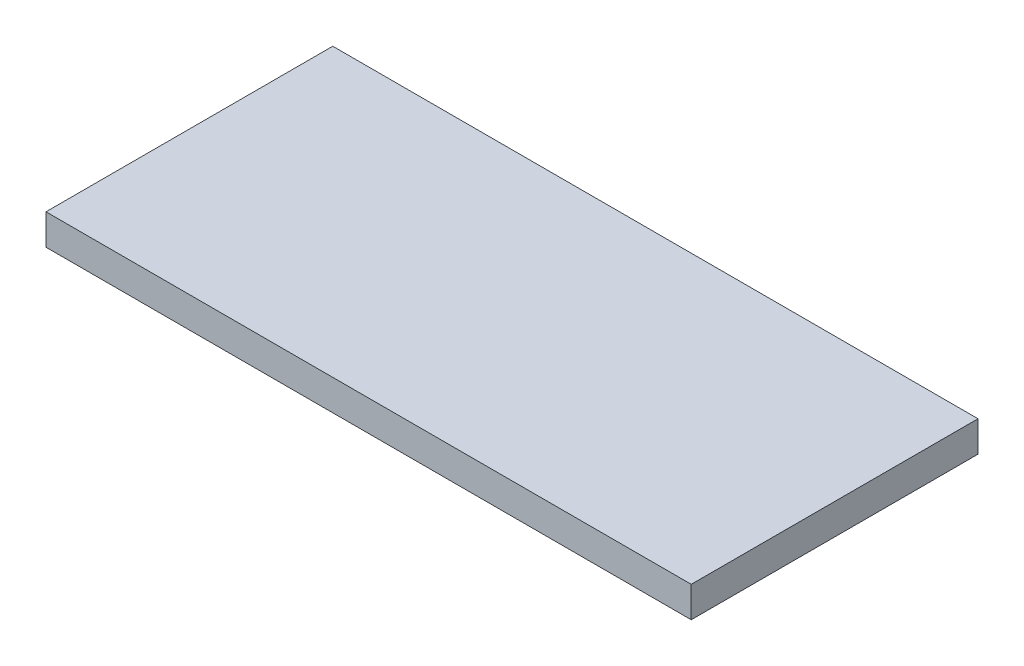
ISO-10303-21;
HEADER;
FILE_DESCRIPTION(('STEP AP214'),'2;1');
FILE_NAME('part.step','',(''),(''),'','','');
FILE_SCHEMA(('AUTOMOTIVE_DESIGN { 1 0 10303 214 1 1 1 1 }'));
ENDSEC;
DATA;
#1=APPLICATION_CONTEXT('core data for automotive mechanical design processes');
#2=APPLICATION_PROTOCOL_DEFINITION('international standard','automotive_design',2000,#1);
#3=PRODUCT_CONTEXT('',#1,'mechanical');
#4=PRODUCT('Part','Part','',(#3));
#5=PRODUCT_RELATED_PRODUCT_CATEGORY('part','',(#4));
#6=PRODUCT_DEFINITION_FORMATION('','',#4);
#7=PRODUCT_DEFINITION_CONTEXT('part definition',#1,'design');
#8=PRODUCT_DEFINITION('design','',#6,#7);
#9=PRODUCT_DEFINITION_SHAPE('','',#8);
#10=(LENGTH_UNIT() NAMED_UNIT(*) SI_UNIT(.MILLI.,.METRE.));
#11=(NAMED_UNIT(*) PLANE_ANGLE_UNIT() SI_UNIT($,.RADIAN.));
#12=(NAMED_UNIT(*) SI_UNIT($,.STERADIAN.) SOLID_ANGLE_UNIT());
#13=UNCERTAINTY_MEASURE_WITH_UNIT(LENGTH_MEASURE(1.E-05),#10,'distance_accuracy_value','');
#14=(GEOMETRIC_REPRESENTATION_CONTEXT(3) GLOBAL_UNCERTAINTY_ASSIGNED_CONTEXT((#13)) GLOBAL_UNIT_ASSIGNED_CONTEXT((#10,
#11,#12)) REPRESENTATION_CONTEXT('',''));
#15=CARTESIAN_POINT('',(0.,0.,0.));
#16=DIRECTION('',(0.,0.,1.));
#17=DIRECTION('',(1.,0.,0.));
#18=AXIS2_PLACEMENT_3D('',#15,#16,#17);
#19=CARTESIAN_POINT('',(-28.1842105263158,3.,-19.7105263157895));
#20=DIRECTION('',(1.,0.,0.));
#21=DIRECTION('',(0.,0.,-1.));
#22=AXIS2_PLACEMENT_3D('',#19,#20,#21);
#23=PLANE('',#22);
#24=DIRECTION('',(0.,0.,1.));
#25=VECTOR('',#24,1.);
#26=CARTESIAN_POINT('',(-28.1842105263158,0.,-19.7105263157895));
#27=LINE('',#26,#25);
#28=CARTESIAN_POINT('',(-28.1842105263158,0.,-19.7105263157895));
#29=VERTEX_POINT('',#28);
#30=CARTESIAN_POINT('',(-28.1842105263158,0.,8.28947368421053));
#31=VERTEX_POINT('',#30);
#32=EDGE_CURVE('E107',#29,#31,#27,.T.);
#33=ORIENTED_EDGE('',*,*,#32,.T.);
#34=DIRECTION('',(0.,-1.,0.));
#35=VECTOR('',#34,1.);
#36=CARTESIAN_POINT('',(-28.1842105263158,3.,8.28947368421053));
#37=LINE('',#36,#35);
#38=CARTESIAN_POINT('',(-28.1842105263158,3.,8.28947368421053));
#39=VERTEX_POINT('',#38);
#40=EDGE_CURVE('E11',#39,#31,#37,.T.);
#41=ORIENTED_EDGE('',*,*,#40,.F.);
#42=DIRECTION('',(0.,0.,1.));
#43=VECTOR('',#42,1.);
#44=CARTESIAN_POINT('',(-28.1842105263158,3.,-19.7105263157895));
#45=LINE('',#44,#43);
#46=CARTESIAN_POINT('',(-28.1842105263158,3.,-19.7105263157895));
#47=VERTEX_POINT('',#46);
#48=EDGE_CURVE('E91',#47,#39,#45,.T.);
#49=ORIENTED_EDGE('',*,*,#48,.F.);
#50=DIRECTION('',(0.,-1.,0.));
#51=VECTOR('',#50,1.);
#52=CARTESIAN_POINT('',(-28.1842105263158,3.,-19.7105263157895));
#53=LINE('',#52,#51);
#54=EDGE_CURVE('E103',#47,#29,#53,.T.);
#55=ORIENTED_EDGE('',*,*,#54,.T.);
#56=EDGE_LOOP('',(#33,#41,#49,#55));
#57=FACE_BOUND('',#56,.T.);
#58=ADVANCED_FACE('F39',(#57),#23,.F.);
#59=CARTESIAN_POINT('',(-28.1842105263158,3.,8.28947368421053));
#60=DIRECTION('',(0.,0.,-1.));
#61=DIRECTION('',(-1.,0.,0.));
#62=AXIS2_PLACEMENT_3D('',#59,#60,#61);
#63=PLANE('',#62);
#64=DIRECTION('',(1.,0.,0.));
#65=VECTOR('',#64,1.);
#66=CARTESIAN_POINT('',(-28.1842105263158,0.,8.28947368421053));
#67=LINE('',#66,#65);
#68=CARTESIAN_POINT('',(34.8157894736842,0.,8.28947368421053));
#69=VERTEX_POINT('',#68);
#70=EDGE_CURVE('E96',#31,#69,#67,.T.);
#71=ORIENTED_EDGE('',*,*,#70,.T.);
#72=DIRECTION('',(0.,-1.,0.));
#73=VECTOR('',#72,1.);
#74=CARTESIAN_POINT('',(34.8157894736842,3.,8.28947368421053));
#75=LINE('',#74,#73);
#76=CARTESIAN_POINT('',(34.8157894736842,3.,8.28947368421053));
#77=VERTEX_POINT('',#76);
#78=EDGE_CURVE('E48',#77,#69,#75,.T.);
#79=ORIENTED_EDGE('',*,*,#78,.F.);
#80=DIRECTION('',(1.,0.,0.));
#81=VECTOR('',#80,1.);
#82=CARTESIAN_POINT('',(-28.1842105263158,3.,8.28947368421053));
#83=LINE('',#82,#81);
#84=EDGE_CURVE('E86',#39,#77,#83,.T.);
#85=ORIENTED_EDGE('',*,*,#84,.F.);
#86=ORIENTED_EDGE('',*,*,#40,.T.);
#87=EDGE_LOOP('',(#71,#79,#85,#86));
#88=FACE_BOUND('',#87,.T.);
#89=ADVANCED_FACE('F95',(#88),#63,.F.);
#90=CARTESIAN_POINT('',(34.8157894736842,3.,-19.7105263157895));
#91=DIRECTION('',(-1.,0.,0.));
#92=DIRECTION('',(0.,0.,1.));
#93=AXIS2_PLACEMENT_3D('',#90,#91,#92);
#94=PLANE('',#93);
#95=DIRECTION('',(0.,0.,-1.));
#96=VECTOR('',#95,1.);
#97=CARTESIAN_POINT('',(34.8157894736842,0.,-19.7105263157895));
#98=LINE('',#97,#96);
#99=CARTESIAN_POINT('',(34.8157894736842,0.,-19.7105263157895));
#100=VERTEX_POINT('',#99);
#101=EDGE_CURVE('E73',#69,#100,#98,.T.);
#102=ORIENTED_EDGE('',*,*,#101,.T.);
#103=DIRECTION('',(0.,-1.,0.));
#104=VECTOR('',#103,1.);
#105=CARTESIAN_POINT('',(34.8157894736842,3.,-19.7105263157895));
#106=LINE('',#105,#104);
#107=CARTESIAN_POINT('',(34.8157894736842,3.,-19.7105263157895));
#108=VERTEX_POINT('',#107);
#109=EDGE_CURVE('E98',#108,#100,#106,.T.);
#110=ORIENTED_EDGE('',*,*,#109,.F.);
#111=DIRECTION('',(0.,0.,-1.));
#112=VECTOR('',#111,1.);
#113=CARTESIAN_POINT('',(34.8157894736842,3.,-19.7105263157895));
#114=LINE('',#113,#112);
#115=EDGE_CURVE('E89',#77,#108,#114,.T.);
#116=ORIENTED_EDGE('',*,*,#115,.F.);
#117=ORIENTED_EDGE('',*,*,#78,.T.);
#118=EDGE_LOOP('',(#102,#110,#116,#117));
#119=FACE_BOUND('',#118,.T.);
#120=ADVANCED_FACE('F99',(#119),#94,.F.);
#121=CARTESIAN_POINT('',(-28.1842105263158,3.,-19.7105263157895));
#122=DIRECTION('',(0.,0.,1.));
#123=DIRECTION('',(1.,0.,0.));
#124=AXIS2_PLACEMENT_3D('',#121,#122,#123);
#125=PLANE('',#124);
#126=DIRECTION('',(-1.,0.,0.));
#127=VECTOR('',#126,1.);
#128=CARTESIAN_POINT('',(-28.1842105263158,0.,-19.7105263157895));
#129=LINE('',#128,#127);
#130=EDGE_CURVE('E79',#100,#29,#129,.T.);
#131=ORIENTED_EDGE('',*,*,#130,.T.);
#132=ORIENTED_EDGE('',*,*,#54,.F.);
#133=DIRECTION('',(-1.,0.,0.));
#134=VECTOR('',#133,1.);
#135=CARTESIAN_POINT('',(-28.1842105263158,3.,-19.7105263157895));
#136=LINE('',#135,#134);
#137=EDGE_CURVE('E56',#108,#47,#136,.T.);
#138=ORIENTED_EDGE('',*,*,#137,.F.);
#139=ORIENTED_EDGE('',*,*,#109,.T.);
#140=EDGE_LOOP('',(#131,#132,#138,#139));
#141=FACE_BOUND('',#140,.T.);
#142=ADVANCED_FACE('F120',(#141),#125,.F.);
#143=CARTESIAN_POINT('',(0.,3.,0.));
#144=DIRECTION('',(0.,1.,0.));
#145=DIRECTION('',(0.,0.,1.));
#146=AXIS2_PLACEMENT_3D('',#143,#144,#145);
#147=PLANE('',#146);
#148=ORIENTED_EDGE('',*,*,#48,.T.);
#149=ORIENTED_EDGE('',*,*,#84,.T.);
#150=ORIENTED_EDGE('',*,*,#115,.T.);
#151=ORIENTED_EDGE('',*,*,#137,.T.);
#152=EDGE_LOOP('',(#148,#149,#150,#151));
#153=FACE_BOUND('',#152,.T.);
#154=ADVANCED_FACE('F87',(#153),#147,.T.);
#155=CARTESIAN_POINT('',(0.,0.,0.));
#156=DIRECTION('',(0.,1.,0.));
#157=DIRECTION('',(0.,0.,1.));
#158=AXIS2_PLACEMENT_3D('',#155,#156,#157);
#159=PLANE('',#158);
#160=ORIENTED_EDGE('',*,*,#32,.F.);
#161=ORIENTED_EDGE('',*,*,#130,.F.);
#162=ORIENTED_EDGE('',*,*,#101,.F.);
#163=ORIENTED_EDGE('',*,*,#70,.F.);
#164=EDGE_LOOP('',(#160,#161,#162,#163));
#165=FACE_BOUND('',#164,.T.);
#166=ADVANCED_FACE('F123',(#165),#159,.F.);
#167=CLOSED_SHELL('',(#58,#89,#120,#142,#154,#166));
#168=MANIFOLD_SOLID_BREP('B2',#167);
#169=ADVANCED_BREP_SHAPE_REPRESENTATION('',(#18,#168),#14);
#170=SHAPE_DEFINITION_REPRESENTATION(#9,#169);
ENDSEC;
END-ISO-10303-21;
